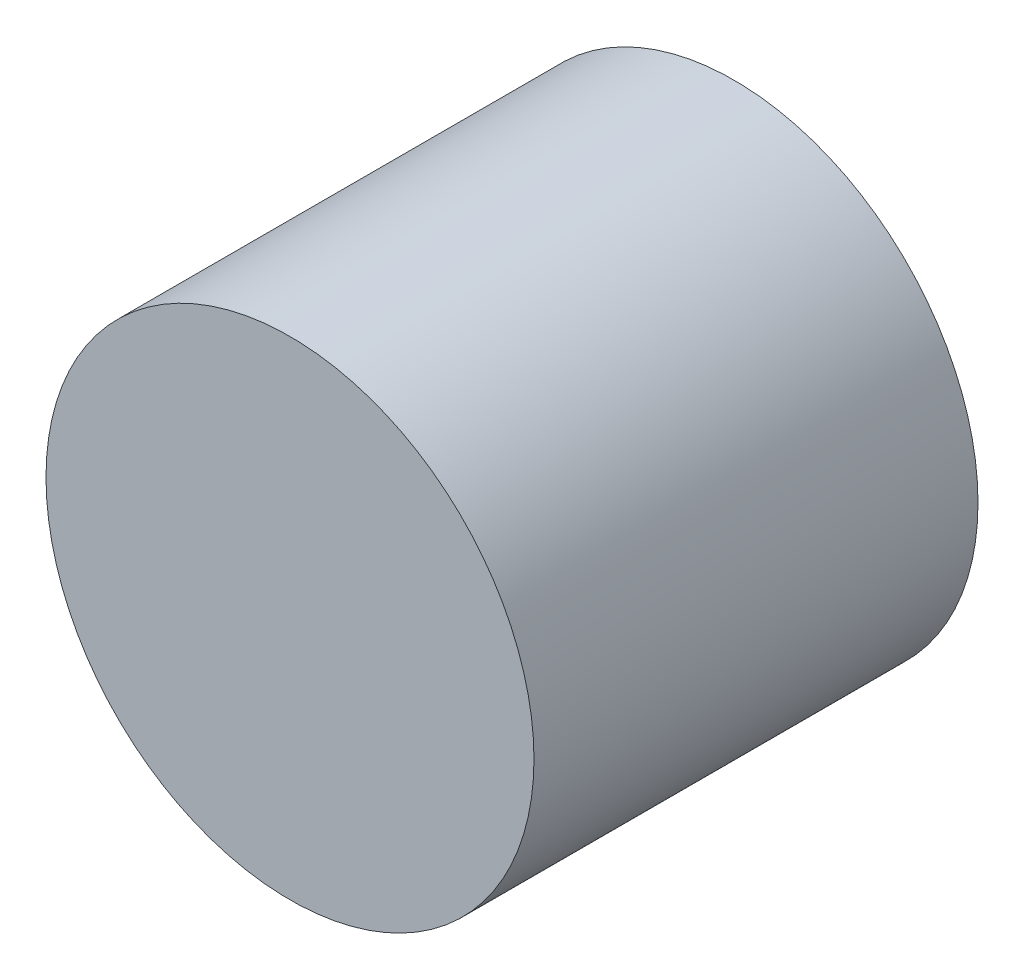
ISO-10303-21;
HEADER;
FILE_DESCRIPTION(('STEP AP214'),'2;1');
FILE_NAME('part.step','',(''),(''),'','','');
FILE_SCHEMA(('AUTOMOTIVE_DESIGN { 1 0 10303 214 1 1 1 1 }'));
ENDSEC;
DATA;
#1=APPLICATION_CONTEXT('core data for automotive mechanical design processes');
#2=APPLICATION_PROTOCOL_DEFINITION('international standard','automotive_design',2000,#1);
#3=PRODUCT_CONTEXT('',#1,'mechanical');
#4=PRODUCT('Part','Part','',(#3));
#5=PRODUCT_RELATED_PRODUCT_CATEGORY('part','',(#4));
#6=PRODUCT_DEFINITION_FORMATION('','',#4);
#7=PRODUCT_DEFINITION_CONTEXT('part definition',#1,'design');
#8=PRODUCT_DEFINITION('design','',#6,#7);
#9=PRODUCT_DEFINITION_SHAPE('','',#8);
#10=(LENGTH_UNIT() NAMED_UNIT(*) SI_UNIT(.MILLI.,.METRE.));
#11=(NAMED_UNIT(*) PLANE_ANGLE_UNIT() SI_UNIT($,.RADIAN.));
#12=(NAMED_UNIT(*) SI_UNIT($,.STERADIAN.) SOLID_ANGLE_UNIT());
#13=UNCERTAINTY_MEASURE_WITH_UNIT(LENGTH_MEASURE(1.E-05),#10,'distance_accuracy_value','');
#14=(GEOMETRIC_REPRESENTATION_CONTEXT(3) GLOBAL_UNCERTAINTY_ASSIGNED_CONTEXT((#13)) GLOBAL_UNIT_ASSIGNED_CONTEXT((#10,
#11,#12)) REPRESENTATION_CONTEXT('',''));
#15=CARTESIAN_POINT('',(0.,0.,0.));
#16=DIRECTION('',(0.,0.,1.));
#17=DIRECTION('',(1.,0.,0.));
#18=AXIS2_PLACEMENT_3D('',#15,#16,#17);
#19=CARTESIAN_POINT('',(0.,0.,-165.644610179245));
#20=DIRECTION('',(0.,0.,1.));
#21=DIRECTION('',(1.,0.,0.));
#22=AXIS2_PLACEMENT_3D('',#19,#20,#21);
#23=CYLINDRICAL_SURFACE('',#22,57.15);
#24=CARTESIAN_POINT('',(0.,0.,-2.));
#25=DIRECTION('',(0.,0.,1.));
#26=DIRECTION('',(1.,0.,0.));
#27=AXIS2_PLACEMENT_3D('',#24,#25,#26);
#28=CIRCLE('',#27,57.15);
#29=CARTESIAN_POINT('',(57.15,0.,-2.));
#30=VERTEX_POINT('',#29);
#31=EDGE_CURVE('E55',#30,#30,#28,.F.);
#32=CARTESIAN_POINT('',(0.,0.,101.9999996618));
#33=DIRECTION('',(0.,0.,1.));
#34=DIRECTION('',(1.,0.,0.));
#35=AXIS2_PLACEMENT_3D('',#32,#33,#34);
#36=CIRCLE('',#35,57.15);
#37=CARTESIAN_POINT('',(57.15,0.,101.9999996618));
#38=VERTEX_POINT('',#37);
#39=EDGE_CURVE('E13',#38,#38,#36,.F.);
#40=CARTESIAN_POINT('',(57.15,0.,-2.));
#41=CARTESIAN_POINT('',(57.15,0.,-0.91666667018958));
#42=CARTESIAN_POINT('',(57.15,0.,0.16666665962084));
#43=CARTESIAN_POINT('',(57.15,0.,2.33333331924167));
#44=CARTESIAN_POINT('',(57.15,0.,3.41666664905208));
#45=CARTESIAN_POINT('',(57.15,0.,5.58333330867291));
#46=CARTESIAN_POINT('',(57.15,0.,6.66666663848332));
#47=CARTESIAN_POINT('',(57.15,0.,8.83333329810415));
#48=CARTESIAN_POINT('',(57.15,0.,9.91666662791457));
#49=CARTESIAN_POINT('',(57.15,0.,12.0833332875354));
#50=CARTESIAN_POINT('',(57.15,0.,13.1666666173458));
#51=CARTESIAN_POINT('',(57.15,0.,15.3333332769667));
#52=CARTESIAN_POINT('',(57.15,0.,16.4166666067771));
#53=CARTESIAN_POINT('',(57.15,0.,18.5833332663979));
#54=CARTESIAN_POINT('',(57.15,0.,19.6666665962083));
#55=CARTESIAN_POINT('',(57.15,0.,21.8333332558291));
#56=CARTESIAN_POINT('',(57.15,0.,22.9166665856396));
#57=CARTESIAN_POINT('',(57.15,0.,25.0833332452604));
#58=CARTESIAN_POINT('',(57.15,0.,26.1666665750708));
#59=CARTESIAN_POINT('',(57.15,0.,28.3333332346917));
#60=CARTESIAN_POINT('',(57.15,0.,29.4166665645021));
#61=CARTESIAN_POINT('',(57.15,0.,31.5833332241229));
#62=CARTESIAN_POINT('',(57.15,0.,32.6666665539333));
#63=CARTESIAN_POINT('',(57.15,0.,34.8333332135541));
#64=CARTESIAN_POINT('',(57.15,0.,35.9166665433646));
#65=CARTESIAN_POINT('',(57.15,0.,38.0833332029854));
#66=CARTESIAN_POINT('',(57.15,0.,39.1666665327958));
#67=CARTESIAN_POINT('',(57.15,0.,41.3333331924167));
#68=CARTESIAN_POINT('',(57.15,0.,42.4166665222271));
#69=CARTESIAN_POINT('',(57.15,0.,44.5833331818479));
#70=CARTESIAN_POINT('',(57.15,0.,45.6666665116583));
#71=CARTESIAN_POINT('',(57.15,0.,47.8333331712791));
#72=CARTESIAN_POINT('',(57.15,0.,48.9166665010896));
#73=CARTESIAN_POINT('',(57.15,0.,51.0833331607104));
#74=CARTESIAN_POINT('',(57.15,0.,52.1666664905208));
#75=CARTESIAN_POINT('',(57.15,0.,54.3333331501417));
#76=CARTESIAN_POINT('',(57.15,0.,55.4166664799521));
#77=CARTESIAN_POINT('',(57.15,0.,57.5833331395729));
#78=CARTESIAN_POINT('',(57.15,0.,58.6666664693833));
#79=CARTESIAN_POINT('',(57.15,0.,60.8333331290041));
#80=CARTESIAN_POINT('',(57.15,0.,61.9166664588146));
#81=CARTESIAN_POINT('',(57.15,0.,64.0833331184354));
#82=CARTESIAN_POINT('',(57.15,0.,65.1666664482458));
#83=CARTESIAN_POINT('',(57.15,0.,67.3333331078666));
#84=CARTESIAN_POINT('',(57.15,0.,68.4166664376771));
#85=CARTESIAN_POINT('',(57.15,0.,70.5833330972979));
#86=CARTESIAN_POINT('',(57.15,0.,71.6666664271083));
#87=CARTESIAN_POINT('',(57.15,0.,73.8333330867291));
#88=CARTESIAN_POINT('',(57.15,0.,74.9166664165395));
#89=CARTESIAN_POINT('',(57.15,0.,77.0833330761604));
#90=CARTESIAN_POINT('',(57.15,0.,78.1666664059708));
#91=CARTESIAN_POINT('',(57.15,0.,80.3333330655916));
#92=CARTESIAN_POINT('',(57.15,0.,81.4166663954021));
#93=CARTESIAN_POINT('',(57.15,0.,83.5833330550229));
#94=CARTESIAN_POINT('',(57.15,0.,84.6666663848333));
#95=CARTESIAN_POINT('',(57.15,0.,86.8333330444541));
#96=CARTESIAN_POINT('',(57.15,0.,87.9166663742645));
#97=CARTESIAN_POINT('',(57.15,0.,90.0833330338854));
#98=CARTESIAN_POINT('',(57.15,0.,91.1666663636958));
#99=CARTESIAN_POINT('',(57.15,0.,93.3333330233166));
#100=CARTESIAN_POINT('',(57.15,0.,94.416666353127));
#101=CARTESIAN_POINT('',(57.15,0.,96.5833330127478));
#102=CARTESIAN_POINT('',(57.15,0.,97.6666663425582));
#103=CARTESIAN_POINT('',(57.15,0.,99.8333330021791));
#104=CARTESIAN_POINT('',(57.15,0.,100.91666633199));
#105=CARTESIAN_POINT('',(57.15,0.,101.9999996618));
#106=B_SPLINE_CURVE_WITH_KNOTS('',3,(#40,#41,#42,#43,#44,#45,#46,#47,#48,#49,#50,#51,#52,#53,
#54,#55,#56,#57,#58,#59,#60,#61,#62,#63,#64,#65,#66,#67,#68,#69,#70,#71,#72,#73,#74,#75,#76,#77,
#78,#79,#80,#81,#82,#83,#84,#85,#86,#87,#88,#89,#90,#91,#92,#93,#94,#95,#96,#97,#98,#99,#100,
#101,#102,#103,#104,#105),.UNSPECIFIED.,.F.,.F.,(4,2,2,2,2,2,2,2,2,2,2,2,2,2,2,2,2,2,2,2,2,2,2,
2,2,2,2,2,2,2,2,2,4),(0.,3.24999998943126,6.4999999788625,9.74999996829373,12.999999957725,
16.2499999471563,19.4999999365875,22.7499999260187,25.99999991545,29.2499999048813,
32.4999998943125,35.7499998837437,38.999999873175,42.2499998626062,45.4999998520375,
48.7499998414687,51.9999998309,55.2499998203312,58.4999998097625,61.7499997991937,
64.999999788625,68.2499997780562,71.4999997674875,74.7499997569187,77.99999974635,
81.2499997357812,84.4999997252125,87.7499997146437,90.9999997040749,94.2499996935062,
97.4999996829374,100.749999672369,103.9999996618),.UNSPECIFIED.);
#107=EDGE_CURVE('BSEAM48',#30,#38,#106,.T.);
#108=ORIENTED_EDGE('',*,*,#31,.F.);
#109=ORIENTED_EDGE('',*,*,#39,.T.);
#110=ORIENTED_EDGE('',*,*,#107,.T.);
#111=ORIENTED_EDGE('',*,*,#107,.F.);
#112=EDGE_LOOP('',(#108,#110,#109,#111));
#113=FACE_BOUND('',#112,.T.);
#114=ADVANCED_FACE('F48',(#113),#23,.T.);
#115=CARTESIAN_POINT('',(0.,0.,-2.));
#116=DIRECTION('',(0.,0.,1.));
#117=DIRECTION('',(1.,0.,0.));
#118=AXIS2_PLACEMENT_3D('',#115,#116,#117);
#119=PLANE('',#118);
#120=ORIENTED_EDGE('',*,*,#31,.T.);
#121=EDGE_LOOP('',(#120));
#122=FACE_BOUND('',#121,.T.);
#123=ADVANCED_FACE('F61',(#122),#119,.F.);
#124=CARTESIAN_POINT('',(0.,0.,101.9999996618));
#125=DIRECTION('',(0.,0.,1.));
#126=DIRECTION('',(1.,0.,0.));
#127=AXIS2_PLACEMENT_3D('',#124,#125,#126);
#128=PLANE('',#127);
#129=ORIENTED_EDGE('',*,*,#39,.F.);
#130=EDGE_LOOP('',(#129));
#131=FACE_BOUND('',#130,.T.);
#132=ADVANCED_FACE('F50',(#131),#128,.T.);
#133=CLOSED_SHELL('',(#114,#123,#132));
#134=MANIFOLD_SOLID_BREP('B2',#133);
#135=ADVANCED_BREP_SHAPE_REPRESENTATION('',(#18,#134),#14);
#136=SHAPE_DEFINITION_REPRESENTATION(#9,#135);
ENDSEC;
END-ISO-10303-21;
